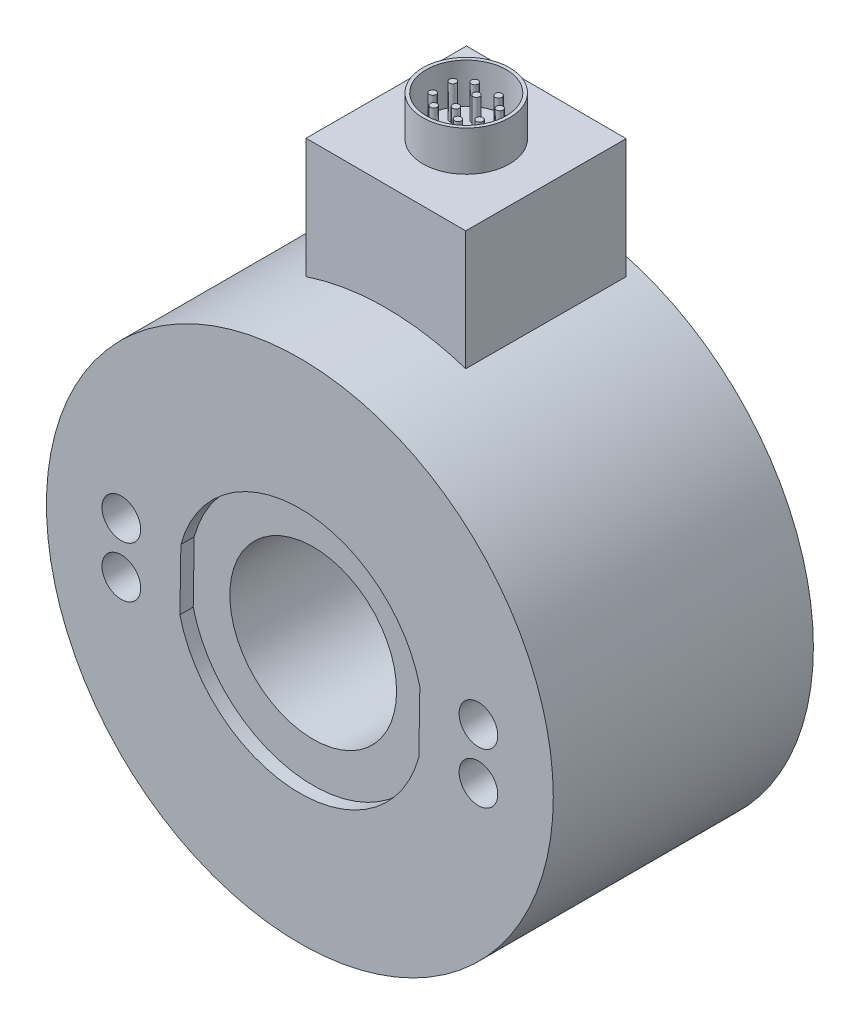
ISO-10303-21;
HEADER;
FILE_DESCRIPTION(('STEP AP214'),'2;1');
FILE_NAME('part.step','',(''),(''),'','','');
FILE_SCHEMA(('AUTOMOTIVE_DESIGN { 1 0 10303 214 1 1 1 1 }'));
ENDSEC;
DATA;
#1=APPLICATION_CONTEXT('core data for automotive mechanical design processes');
#2=APPLICATION_PROTOCOL_DEFINITION('international standard','automotive_design',2000,#1);
#3=PRODUCT_CONTEXT('',#1,'mechanical');
#4=PRODUCT('Part','Part','',(#3));
#5=PRODUCT_RELATED_PRODUCT_CATEGORY('part','',(#4));
#6=PRODUCT_DEFINITION_FORMATION('','',#4);
#7=PRODUCT_DEFINITION_CONTEXT('part definition',#1,'design');
#8=PRODUCT_DEFINITION('design','',#6,#7);
#9=PRODUCT_DEFINITION_SHAPE('','',#8);
#10=(LENGTH_UNIT() NAMED_UNIT(*) SI_UNIT(.MILLI.,.METRE.));
#11=(NAMED_UNIT(*) PLANE_ANGLE_UNIT() SI_UNIT($,.RADIAN.));
#12=(NAMED_UNIT(*) SI_UNIT($,.STERADIAN.) SOLID_ANGLE_UNIT());
#13=UNCERTAINTY_MEASURE_WITH_UNIT(LENGTH_MEASURE(1.E-05),#10,'distance_accuracy_value','');
#14=(GEOMETRIC_REPRESENTATION_CONTEXT(3) GLOBAL_UNCERTAINTY_ASSIGNED_CONTEXT((#13)) GLOBAL_UNIT_ASSIGNED_CONTEXT((#10,
#11,#12)) REPRESENTATION_CONTEXT('',''));
#15=CARTESIAN_POINT('',(0.,0.,0.));
#16=DIRECTION('',(0.,0.,1.));
#17=DIRECTION('',(1.,0.,0.));
#18=AXIS2_PLACEMENT_3D('',#15,#16,#17);
#19=CARTESIAN_POINT('',(0.,0.,39.));
#20=DIRECTION('',(0.,0.,-1.));
#21=DIRECTION('',(-1.,0.,0.));
#22=AXIS2_PLACEMENT_3D('',#19,#20,#21);
#23=CYLINDRICAL_SURFACE('',#22,38.);
#24=CARTESIAN_POINT('',(0.,0.,0.));
#25=DIRECTION('',(0.,0.,1.));
#26=DIRECTION('',(1.,0.,0.));
#27=AXIS2_PLACEMENT_3D('',#24,#25,#26);
#28=CIRCLE('',#27,38.);
#29=CARTESIAN_POINT('',(38.,0.,0.));
#30=VERTEX_POINT('',#29);
#31=EDGE_CURVE('E213',#30,#30,#28,.T.);
#32=ORIENTED_EDGE('',*,*,#31,.T.);
#33=EDGE_LOOP('',(#32));
#34=FACE_BOUND('',#33,.T.);
#35=CARTESIAN_POINT('',(0.,0.,39.));
#36=DIRECTION('',(0.,0.,1.));
#37=DIRECTION('',(1.,0.,0.));
#38=AXIS2_PLACEMENT_3D('',#35,#36,#37);
#39=CIRCLE('',#38,38.);
#40=CARTESIAN_POINT('',(38.,0.,39.));
#41=VERTEX_POINT('',#40);
#42=EDGE_CURVE('E222',#41,#41,#39,.T.);
#43=ORIENTED_EDGE('',*,*,#42,.F.);
#44=EDGE_LOOP('',(#43));
#45=FACE_BOUND('',#44,.T.);
#46=CARTESIAN_POINT('',(0.,0.,4932.63036177343));
#47=DIRECTION('',(-0.999997061406116,0.,-0.00242428940788655));
#48=DIRECTION('',(0.00242428940788655,0.,-0.999997061406116));
#49=AXIS2_PLACEMENT_3D('',#46,#47,#48);
#50=ELLIPSE('',#49,15674.6962125812,38.);
#51=CARTESIAN_POINT('',(11.895058188121,36.0902700281006,26.0283716481391));
#52=VERTEX_POINT('',#51);
#53=CARTESIAN_POINT('',(11.9532411339103,36.0710413821752,2.02844217439234));
#54=VERTEX_POINT('',#53);
#55=EDGE_CURVE('E265',#52,#54,#50,.T.);
#56=ORIENTED_EDGE('',*,*,#55,.F.);
#57=CARTESIAN_POINT('',(0.,0.,25.9995344998268));
#58=DIRECTION('',(0.00242428940788655,0.,-0.999997061406116));
#59=DIRECTION('',(-0.999997061406116,0.,-0.00242428940788655));
#60=AXIS2_PLACEMENT_3D('',#57,#58,#59);
#61=ELLIPSE('',#60,38.0001116668957,38.);
#62=CARTESIAN_POINT('',(-12.1048712856257,36.0204399078972,25.9701887023498));
#63=VERTEX_POINT('',#62);
#64=EDGE_CURVE('E236',#63,#52,#61,.T.);
#65=ORIENTED_EDGE('',*,*,#64,.F.);
#66=CARTESIAN_POINT('',(0.,0.,-4967.17777248854));
#67=DIRECTION('',(0.999997061406116,0.,0.00242428940788647));
#68=DIRECTION('',(0.00242428940788647,0.,-0.999997061406116));
#69=AXIS2_PLACEMENT_3D('',#66,#67,#68);
#70=ELLIPSE('',#69,15674.6962125817,38.);
#71=CARTESIAN_POINT('',(-12.0466883398365,36.0399403446072,1.97025922860306));
#72=VERTEX_POINT('',#71);
#73=EDGE_CURVE('E60',#72,#63,#70,.T.);
#74=ORIENTED_EDGE('',*,*,#73,.F.);
#75=CARTESIAN_POINT('',(0.,0.,1.99946397336632));
#76=DIRECTION('',(-0.00242428940788669,0.,0.999997061406116));
#77=DIRECTION('',(-0.999997061406116,0.,-0.00242428940788669));
#78=AXIS2_PLACEMENT_3D('',#75,#76,#77);
#79=ELLIPSE('',#78,38.0001116668957,38.);
#80=EDGE_CURVE('E55',#54,#72,#79,.T.);
#81=ORIENTED_EDGE('',*,*,#80,.F.);
#82=EDGE_LOOP('',(#56,#65,#74,#81));
#83=FACE_BOUND('',#82,.T.);
#84=ADVANCED_FACE('F39',(#34,#45,#83),#23,.T.);
#85=CARTESIAN_POINT('',(0.,0.,0.));
#86=DIRECTION('',(0.,0.,1.));
#87=DIRECTION('',(1.,0.,0.));
#88=AXIS2_PLACEMENT_3D('',#85,#86,#87);
#89=PLANE('',#88);
#90=CARTESIAN_POINT('',(0.,0.,0.));
#91=DIRECTION('',(0.,0.,1.));
#92=DIRECTION('',(1.,0.,0.));
#93=AXIS2_PLACEMENT_3D('',#90,#91,#92);
#94=CIRCLE('',#93,12.5);
#95=CARTESIAN_POINT('',(12.5,0.,0.));
#96=VERTEX_POINT('',#95);
#97=EDGE_CURVE('E146',#96,#96,#94,.T.);
#98=ORIENTED_EDGE('',*,*,#97,.T.);
#99=EDGE_LOOP('',(#98));
#100=FACE_BOUND('',#99,.T.);
#101=CARTESIAN_POINT('',(0.,0.,0.));
#102=DIRECTION('',(0.,0.,-1.));
#103=DIRECTION('',(-1.,0.,0.));
#104=AXIS2_PLACEMENT_3D('',#101,#102,#103);
#105=CIRCLE('',#104,13.);
#106=CARTESIAN_POINT('',(-13.,0.,0.));
#107=VERTEX_POINT('',#106);
#108=EDGE_CURVE('E209',#107,#107,#105,.T.);
#109=ORIENTED_EDGE('',*,*,#108,.T.);
#110=EDGE_LOOP('',(#109));
#111=FACE_BOUND('',#110,.T.);
#112=ADVANCED_FACE('F339',(#100,#111),#89,.F.);
#113=CARTESIAN_POINT('',(0.,0.,0.));
#114=DIRECTION('',(0.,0.,1.));
#115=DIRECTION('',(1.,0.,0.));
#116=AXIS2_PLACEMENT_3D('',#113,#114,#115);
#117=CIRCLE('',#116,17.);
#118=CARTESIAN_POINT('',(17.,0.,0.));
#119=VERTEX_POINT('',#118);
#120=EDGE_CURVE('E210',#119,#119,#117,.T.);
#121=ORIENTED_EDGE('',*,*,#120,.T.);
#122=EDGE_LOOP('',(#121));
#123=FACE_BOUND('',#122,.T.);
#124=ORIENTED_EDGE('',*,*,#31,.F.);
#125=EDGE_LOOP('',(#124));
#126=FACE_BOUND('',#125,.T.);
#127=ADVANCED_FACE('F345',(#123,#126),#89,.F.);
#128=CARTESIAN_POINT('',(0.,0.,39.));
#129=DIRECTION('',(0.,0.,1.));
#130=DIRECTION('',(1.,0.,0.));
#131=AXIS2_PLACEMENT_3D('',#128,#129,#130);
#132=PLANE('',#131);
#133=CARTESIAN_POINT('',(-26.7725934929181,3.81386705156384,39.));
#134=DIRECTION('',(0.,0.,1.));
#135=DIRECTION('',(1.,0.,0.));
#136=AXIS2_PLACEMENT_3D('',#133,#134,#135);
#137=CIRCLE('',#136,2.9);
#138=CARTESIAN_POINT('',(-23.872593492918,3.81386705156384,39.));
#139=VERTEX_POINT('',#138);
#140=EDGE_CURVE('E124',#139,#139,#137,.T.);
#141=ORIENTED_EDGE('',*,*,#140,.F.);
#142=EDGE_LOOP('',(#141));
#143=FACE_BOUND('',#142,.T.);
#144=CARTESIAN_POINT('',(-26.7725934929181,-3.81386705156384,39.));
#145=DIRECTION('',(0.,0.,1.));
#146=DIRECTION('',(1.,0.,0.));
#147=AXIS2_PLACEMENT_3D('',#144,#145,#146);
#148=CIRCLE('',#147,2.9);
#149=CARTESIAN_POINT('',(-23.872593492918,-3.81386705156384,39.));
#150=VERTEX_POINT('',#149);
#151=EDGE_CURVE('E123',#150,#150,#148,.T.);
#152=ORIENTED_EDGE('',*,*,#151,.F.);
#153=EDGE_LOOP('',(#152));
#154=FACE_BOUND('',#153,.T.);
#155=CARTESIAN_POINT('',(26.7725934929181,3.81386705156384,39.));
#156=DIRECTION('',(0.,0.,1.));
#157=DIRECTION('',(1.,0.,0.));
#158=AXIS2_PLACEMENT_3D('',#155,#156,#157);
#159=CIRCLE('',#158,2.9);
#160=CARTESIAN_POINT('',(29.6725934929181,3.81386705156384,39.));
#161=VERTEX_POINT('',#160);
#162=EDGE_CURVE('E134',#161,#161,#159,.T.);
#163=ORIENTED_EDGE('',*,*,#162,.F.);
#164=EDGE_LOOP('',(#163));
#165=FACE_BOUND('',#164,.T.);
#166=CARTESIAN_POINT('',(26.7725934929181,-3.81386705156384,39.));
#167=DIRECTION('',(0.,0.,1.));
#168=DIRECTION('',(1.,0.,0.));
#169=AXIS2_PLACEMENT_3D('',#166,#167,#168);
#170=CIRCLE('',#169,2.9);
#171=CARTESIAN_POINT('',(29.6725934929181,-3.81386705156384,39.));
#172=VERTEX_POINT('',#171);
#173=EDGE_CURVE('E140',#172,#172,#170,.T.);
#174=ORIENTED_EDGE('',*,*,#173,.F.);
#175=EDGE_LOOP('',(#174));
#176=FACE_BOUND('',#175,.T.);
#177=CARTESIAN_POINT('',(0.,0.,39.));
#178=DIRECTION('',(0.,0.,1.));
#179=DIRECTION('',(1.,0.,0.));
#180=AXIS2_PLACEMENT_3D('',#177,#178,#179);
#181=CIRCLE('',#180,18.5);
#182=CARTESIAN_POINT('',(17.9892851101113,4.31689949235877,39.));
#183=VERTEX_POINT('',#182);
#184=CARTESIAN_POINT('',(-17.8405992738003,4.8952035250516,39.));
#185=VERTEX_POINT('',#184);
#186=EDGE_CURVE('E246',#183,#185,#181,.T.);
#187=ORIENTED_EDGE('',*,*,#186,.F.);
#188=DIRECTION('',(-0.0161381687615908,-0.999869771274751,0.));
#189=VECTOR('',#188,1.);
#190=CARTESIAN_POINT('',(17.9892851101113,4.31689949235877,39.));
#191=LINE('',#190,#189);
#192=CARTESIAN_POINT('',(17.8405992738003,-4.8952035250516,39.));
#193=VERTEX_POINT('',#192);
#194=EDGE_CURVE('E221',#183,#193,#191,.T.);
#195=ORIENTED_EDGE('',*,*,#194,.T.);
#196=CARTESIAN_POINT('',(0.,0.,39.));
#197=DIRECTION('',(0.,0.,1.));
#198=DIRECTION('',(1.,0.,0.));
#199=AXIS2_PLACEMENT_3D('',#196,#197,#198);
#200=CIRCLE('',#199,18.5);
#201=CARTESIAN_POINT('',(-17.9892851101113,-4.31689949235877,39.));
#202=VERTEX_POINT('',#201);
#203=EDGE_CURVE('E240',#202,#193,#200,.T.);
#204=ORIENTED_EDGE('',*,*,#203,.F.);
#205=DIRECTION('',(0.0161381687615908,0.999869771274751,0.));
#206=VECTOR('',#205,1.);
#207=CARTESIAN_POINT('',(-17.9892851101113,-4.31689949235877,39.));
#208=LINE('',#207,#206);
#209=EDGE_CURVE('E225',#202,#185,#208,.T.);
#210=ORIENTED_EDGE('',*,*,#209,.T.);
#211=EDGE_LOOP('',(#187,#195,#204,#210));
#212=FACE_BOUND('',#211,.T.);
#213=ORIENTED_EDGE('',*,*,#42,.T.);
#214=EDGE_LOOP('',(#213));
#215=FACE_BOUND('',#214,.T.);
#216=ADVANCED_FACE('F354',(#143,#154,#165,#176,#212,#215),#132,.T.);
#217=CARTESIAN_POINT('',(0.,0.,2.));
#218=DIRECTION('',(0.,0.,-1.));
#219=DIRECTION('',(-1.,0.,0.));
#220=AXIS2_PLACEMENT_3D('',#217,#218,#219);
#221=CYLINDRICAL_SURFACE('',#220,13.);
#222=CARTESIAN_POINT('',(0.,0.,2.));
#223=DIRECTION('',(0.,0.,-1.));
#224=DIRECTION('',(-1.,0.,0.));
#225=AXIS2_PLACEMENT_3D('',#222,#223,#224);
#226=CIRCLE('',#225,13.);
#227=CARTESIAN_POINT('',(-13.,0.,2.));
#228=VERTEX_POINT('',#227);
#229=EDGE_CURVE('E218',#228,#228,#226,.T.);
#230=ORIENTED_EDGE('',*,*,#229,.T.);
#231=EDGE_LOOP('',(#230));
#232=FACE_BOUND('',#231,.T.);
#233=ORIENTED_EDGE('',*,*,#108,.F.);
#234=EDGE_LOOP('',(#233));
#235=FACE_BOUND('',#234,.T.);
#236=ADVANCED_FACE('F358',(#232,#235),#221,.T.);
#237=CARTESIAN_POINT('',(0.,0.,2.));
#238=DIRECTION('',(0.,0.,-1.));
#239=DIRECTION('',(-1.,0.,0.));
#240=AXIS2_PLACEMENT_3D('',#237,#238,#239);
#241=CYLINDRICAL_SURFACE('',#240,16.);
#242=CARTESIAN_POINT('',(0.,0.,1.));
#243=DIRECTION('',(0.,0.,1.));
#244=DIRECTION('',(1.,0.,0.));
#245=AXIS2_PLACEMENT_3D('',#242,#243,#244);
#246=CIRCLE('',#245,16.);
#247=CARTESIAN_POINT('',(16.,0.,1.));
#248=VERTEX_POINT('',#247);
#249=EDGE_CURVE('E214',#248,#248,#246,.F.);
#250=ORIENTED_EDGE('',*,*,#249,.T.);
#251=EDGE_LOOP('',(#250));
#252=FACE_BOUND('',#251,.T.);
#253=CARTESIAN_POINT('',(0.,0.,2.));
#254=DIRECTION('',(0.,0.,-1.));
#255=DIRECTION('',(-1.,0.,0.));
#256=AXIS2_PLACEMENT_3D('',#253,#254,#255);
#257=CIRCLE('',#256,16.);
#258=CARTESIAN_POINT('',(-16.,0.,2.));
#259=VERTEX_POINT('',#258);
#260=EDGE_CURVE('E217',#259,#259,#257,.T.);
#261=ORIENTED_EDGE('',*,*,#260,.F.);
#262=EDGE_LOOP('',(#261));
#263=FACE_BOUND('',#262,.T.);
#264=ADVANCED_FACE('F362',(#252,#263),#241,.F.);
#265=CARTESIAN_POINT('',(0.,0.,2.));
#266=DIRECTION('',(0.,0.,-1.));
#267=DIRECTION('',(-1.,0.,0.));
#268=AXIS2_PLACEMENT_3D('',#265,#266,#267);
#269=PLANE('',#268);
#270=ORIENTED_EDGE('',*,*,#229,.F.);
#271=EDGE_LOOP('',(#270));
#272=FACE_BOUND('',#271,.T.);
#273=ORIENTED_EDGE('',*,*,#260,.T.);
#274=EDGE_LOOP('',(#273));
#275=FACE_BOUND('',#274,.T.);
#276=ADVANCED_FACE('F366',(#272,#275),#269,.T.);
#277=CARTESIAN_POINT('',(0.,0.,1.));
#278=DIRECTION('',(0.,0.,1.));
#279=DIRECTION('',(1.,0.,0.));
#280=AXIS2_PLACEMENT_3D('',#277,#278,#279);
#281=TOROIDAL_SURFACE('',#280,17.,1.);
#282=ORIENTED_EDGE('',*,*,#120,.F.);
#283=EDGE_LOOP('',(#282));
#284=FACE_BOUND('',#283,.T.);
#285=ORIENTED_EDGE('',*,*,#249,.F.);
#286=EDGE_LOOP('',(#285));
#287=FACE_BOUND('',#286,.T.);
#288=ADVANCED_FACE('F350',(#284,#287),#281,.T.);
#289=CARTESIAN_POINT('',(0.,0.,37.));
#290=DIRECTION('',(0.,0.,1.));
#291=DIRECTION('',(1.,0.,0.));
#292=AXIS2_PLACEMENT_3D('',#289,#290,#291);
#293=PLANE('',#292);
#294=CARTESIAN_POINT('',(0.,0.,37.));
#295=DIRECTION('',(0.,0.,1.));
#296=DIRECTION('',(1.,0.,0.));
#297=AXIS2_PLACEMENT_3D('',#294,#295,#296);
#298=CIRCLE('',#297,12.5);
#299=CARTESIAN_POINT('',(12.5,0.,37.));
#300=VERTEX_POINT('',#299);
#301=EDGE_CURVE('E43',#300,#300,#298,.T.);
#302=ORIENTED_EDGE('',*,*,#301,.F.);
#303=EDGE_LOOP('',(#302));
#304=FACE_BOUND('',#303,.T.);
#305=CARTESIAN_POINT('',(0.,0.,37.));
#306=DIRECTION('',(0.,0.,1.));
#307=DIRECTION('',(1.,0.,0.));
#308=AXIS2_PLACEMENT_3D('',#305,#306,#307);
#309=CIRCLE('',#308,18.5);
#310=CARTESIAN_POINT('',(17.9892851101113,4.31689949235877,37.));
#311=VERTEX_POINT('',#310);
#312=CARTESIAN_POINT('',(-17.8405992738003,4.8952035250516,37.));
#313=VERTEX_POINT('',#312);
#314=EDGE_CURVE('E230',#311,#313,#309,.T.);
#315=ORIENTED_EDGE('',*,*,#314,.T.);
#316=DIRECTION('',(0.0161381687615908,0.999869771274751,0.));
#317=VECTOR('',#316,1.);
#318=CARTESIAN_POINT('',(-17.9892851101113,-4.31689949235877,37.));
#319=LINE('',#318,#317);
#320=CARTESIAN_POINT('',(-17.9892851101113,-4.31689949235877,37.));
#321=VERTEX_POINT('',#320);
#322=EDGE_CURVE('E237',#321,#313,#319,.T.);
#323=ORIENTED_EDGE('',*,*,#322,.F.);
#324=CARTESIAN_POINT('',(0.,0.,37.));
#325=DIRECTION('',(0.,0.,1.));
#326=DIRECTION('',(1.,0.,0.));
#327=AXIS2_PLACEMENT_3D('',#324,#325,#326);
#328=CIRCLE('',#327,18.5);
#329=CARTESIAN_POINT('',(17.8405992738003,-4.8952035250516,37.));
#330=VERTEX_POINT('',#329);
#331=EDGE_CURVE('E254',#321,#330,#328,.T.);
#332=ORIENTED_EDGE('',*,*,#331,.T.);
#333=DIRECTION('',(-0.0161381687615908,-0.999869771274751,0.));
#334=VECTOR('',#333,1.);
#335=CARTESIAN_POINT('',(17.9892851101113,4.31689949235877,37.));
#336=LINE('',#335,#334);
#337=EDGE_CURVE('E243',#311,#330,#336,.T.);
#338=ORIENTED_EDGE('',*,*,#337,.F.);
#339=EDGE_LOOP('',(#315,#323,#332,#338));
#340=FACE_BOUND('',#339,.T.);
#341=ADVANCED_FACE('F41',(#304,#340),#293,.T.);
#342=CARTESIAN_POINT('',(0.,0.,37.));
#343=DIRECTION('',(0.,0.,1.));
#344=DIRECTION('',(1.,0.,0.));
#345=AXIS2_PLACEMENT_3D('',#342,#343,#344);
#346=CYLINDRICAL_SURFACE('',#345,18.5);
#347=ORIENTED_EDGE('',*,*,#186,.T.);
#348=DIRECTION('',(0.,0.,1.));
#349=VECTOR('',#348,1.);
#350=CARTESIAN_POINT('',(-17.8405992738003,4.8952035250516,37.));
#351=LINE('',#350,#349);
#352=EDGE_CURVE('E233',#313,#185,#351,.T.);
#353=ORIENTED_EDGE('',*,*,#352,.F.);
#354=ORIENTED_EDGE('',*,*,#314,.F.);
#355=DIRECTION('',(0.,0.,1.));
#356=VECTOR('',#355,1.);
#357=CARTESIAN_POINT('',(17.9892851101113,4.31689949235877,37.));
#358=LINE('',#357,#356);
#359=EDGE_CURVE('E244',#311,#183,#358,.T.);
#360=ORIENTED_EDGE('',*,*,#359,.T.);
#361=EDGE_LOOP('',(#347,#353,#354,#360));
#362=FACE_BOUND('',#361,.T.);
#363=ADVANCED_FACE('F371',(#362),#346,.F.);
#364=CARTESIAN_POINT('',(17.9892851101113,4.31689949235877,37.));
#365=DIRECTION('',(-0.999869771274751,0.0161381687615908,0.));
#366=DIRECTION('',(-0.0161381687615909,-0.999869771274751,0.));
#367=AXIS2_PLACEMENT_3D('',#364,#365,#366);
#368=PLANE('',#367);
#369=ORIENTED_EDGE('',*,*,#194,.F.);
#370=ORIENTED_EDGE('',*,*,#359,.F.);
#371=ORIENTED_EDGE('',*,*,#337,.T.);
#372=DIRECTION('',(0.,0.,1.));
#373=VECTOR('',#372,1.);
#374=CARTESIAN_POINT('',(17.8405992738003,-4.8952035250516,37.));
#375=LINE('',#374,#373);
#376=EDGE_CURVE('E241',#330,#193,#375,.T.);
#377=ORIENTED_EDGE('',*,*,#376,.T.);
#378=EDGE_LOOP('',(#369,#370,#371,#377));
#379=FACE_BOUND('',#378,.T.);
#380=ADVANCED_FACE('F374',(#379),#368,.T.);
#381=CARTESIAN_POINT('',(0.,0.,37.));
#382=DIRECTION('',(0.,0.,1.));
#383=DIRECTION('',(1.,0.,0.));
#384=AXIS2_PLACEMENT_3D('',#381,#382,#383);
#385=CYLINDRICAL_SURFACE('',#384,18.5);
#386=ORIENTED_EDGE('',*,*,#203,.T.);
#387=ORIENTED_EDGE('',*,*,#376,.F.);
#388=ORIENTED_EDGE('',*,*,#331,.F.);
#389=DIRECTION('',(0.,0.,1.));
#390=VECTOR('',#389,1.);
#391=CARTESIAN_POINT('',(-17.9892851101113,-4.31689949235877,37.));
#392=LINE('',#391,#390);
#393=EDGE_CURVE('E238',#321,#202,#392,.T.);
#394=ORIENTED_EDGE('',*,*,#393,.T.);
#395=EDGE_LOOP('',(#386,#387,#388,#394));
#396=FACE_BOUND('',#395,.T.);
#397=ADVANCED_FACE('F380',(#396),#385,.F.);
#398=CARTESIAN_POINT('',(-17.9892851101113,-4.31689949235877,37.));
#399=DIRECTION('',(0.999869771274751,-0.0161381687615908,0.));
#400=DIRECTION('',(0.0161381687615909,0.999869771274751,0.));
#401=AXIS2_PLACEMENT_3D('',#398,#399,#400);
#402=PLANE('',#401);
#403=ORIENTED_EDGE('',*,*,#209,.F.);
#404=ORIENTED_EDGE('',*,*,#393,.F.);
#405=ORIENTED_EDGE('',*,*,#322,.T.);
#406=ORIENTED_EDGE('',*,*,#352,.T.);
#407=EDGE_LOOP('',(#403,#404,#405,#406));
#408=FACE_BOUND('',#407,.T.);
#409=ADVANCED_FACE('F376',(#408),#402,.T.);
#410=CARTESIAN_POINT('',(11.895058188121,54.,26.0283716481391));
#411=DIRECTION('',(-0.999997061406116,0.,-0.00242428940788655));
#412=DIRECTION('',(-0.00242428940788655,0.,0.999997061406116));
#413=AXIS2_PLACEMENT_3D('',#410,#411,#412);
#414=PLANE('',#413);
#415=DIRECTION('',(0.,-1.,0.));
#416=VECTOR('',#415,1.);
#417=CARTESIAN_POINT('',(11.895058188121,54.,26.0283716481391));
#418=LINE('',#417,#416);
#419=CARTESIAN_POINT('',(11.895058188121,54.,26.0283716481391));
#420=VERTEX_POINT('',#419);
#421=EDGE_CURVE('E197',#420,#52,#418,.T.);
#422=ORIENTED_EDGE('',*,*,#421,.T.);
#423=ORIENTED_EDGE('',*,*,#55,.T.);
#424=DIRECTION('',(0.,-1.,0.));
#425=VECTOR('',#424,1.);
#426=CARTESIAN_POINT('',(11.9532411339103,54.,2.02844217439234));
#427=LINE('',#426,#425);
#428=CARTESIAN_POINT('',(11.9532411339103,54.,2.02844217439234));
#429=VERTEX_POINT('',#428);
#430=EDGE_CURVE('E206',#429,#54,#427,.T.);
#431=ORIENTED_EDGE('',*,*,#430,.F.);
#432=DIRECTION('',(0.00242428940788655,0.,-0.999997061406116));
#433=VECTOR('',#432,1.);
#434=CARTESIAN_POINT('',(11.895058188121,54.,26.0283716481391));
#435=LINE('',#434,#433);
#436=EDGE_CURVE('E186',#420,#429,#435,.T.);
#437=ORIENTED_EDGE('',*,*,#436,.F.);
#438=EDGE_LOOP('',(#422,#423,#431,#437));
#439=FACE_BOUND('',#438,.T.);
#440=ADVANCED_FACE('F379',(#439),#414,.F.);
#441=CARTESIAN_POINT('',(-12.0466883398365,54.,1.97025922860306));
#442=DIRECTION('',(-0.00242428940788669,0.,0.999997061406116));
#443=DIRECTION('',(0.999997061406116,0.,0.00242428940788669));
#444=AXIS2_PLACEMENT_3D('',#441,#442,#443);
#445=PLANE('',#444);
#446=ORIENTED_EDGE('',*,*,#430,.T.);
#447=ORIENTED_EDGE('',*,*,#80,.T.);
#448=DIRECTION('',(0.,-1.,0.));
#449=VECTOR('',#448,1.);
#450=CARTESIAN_POINT('',(-12.0466883398365,54.,1.97025922860306));
#451=LINE('',#450,#449);
#452=CARTESIAN_POINT('',(-12.0466883398365,54.,1.97025922860306));
#453=VERTEX_POINT('',#452);
#454=EDGE_CURVE('E203',#453,#72,#451,.T.);
#455=ORIENTED_EDGE('',*,*,#454,.F.);
#456=DIRECTION('',(-0.999997061406116,0.,-0.00242428940788669));
#457=VECTOR('',#456,1.);
#458=CARTESIAN_POINT('',(-12.0466883398365,54.,1.97025922860306));
#459=LINE('',#458,#457);
#460=EDGE_CURVE('E191',#429,#453,#459,.T.);
#461=ORIENTED_EDGE('',*,*,#460,.F.);
#462=EDGE_LOOP('',(#446,#447,#455,#461));
#463=FACE_BOUND('',#462,.T.);
#464=ADVANCED_FACE('F522',(#463),#445,.F.);
#465=CARTESIAN_POINT('',(-12.1048712856257,54.,25.9701887023498));
#466=DIRECTION('',(0.999997061406116,0.,0.00242428940788647));
#467=DIRECTION('',(0.00242428940788647,0.,-0.999997061406116));
#468=AXIS2_PLACEMENT_3D('',#465,#466,#467);
#469=PLANE('',#468);
#470=ORIENTED_EDGE('',*,*,#454,.T.);
#471=ORIENTED_EDGE('',*,*,#73,.T.);
#472=DIRECTION('',(0.,-1.,0.));
#473=VECTOR('',#472,1.);
#474=CARTESIAN_POINT('',(-12.1048712856257,54.,25.9701887023498));
#475=LINE('',#474,#473);
#476=CARTESIAN_POINT('',(-12.1048712856257,54.,25.9701887023498));
#477=VERTEX_POINT('',#476);
#478=EDGE_CURVE('E200',#477,#63,#475,.T.);
#479=ORIENTED_EDGE('',*,*,#478,.F.);
#480=DIRECTION('',(-0.00242428940788647,0.,0.999997061406116));
#481=VECTOR('',#480,1.);
#482=CARTESIAN_POINT('',(-12.1048712856257,54.,25.9701887023498));
#483=LINE('',#482,#481);
#484=EDGE_CURVE('E193',#453,#477,#483,.T.);
#485=ORIENTED_EDGE('',*,*,#484,.F.);
#486=EDGE_LOOP('',(#470,#471,#479,#485));
#487=FACE_BOUND('',#486,.T.);
#488=ADVANCED_FACE('F526',(#487),#469,.F.);
#489=CARTESIAN_POINT('',(-12.1048712856257,54.,25.9701887023498));
#490=DIRECTION('',(0.00242428940788655,0.,-0.999997061406116));
#491=DIRECTION('',(-0.999997061406116,0.,-0.00242428940788655));
#492=AXIS2_PLACEMENT_3D('',#489,#490,#491);
#493=PLANE('',#492);
#494=ORIENTED_EDGE('',*,*,#478,.T.);
#495=ORIENTED_EDGE('',*,*,#64,.T.);
#496=ORIENTED_EDGE('',*,*,#421,.F.);
#497=DIRECTION('',(0.999997061406116,0.,0.00242428940788655));
#498=VECTOR('',#497,1.);
#499=CARTESIAN_POINT('',(-12.1048712856257,54.,25.9701887023498));
#500=LINE('',#499,#498);
#501=EDGE_CURVE('E195',#477,#420,#500,.T.);
#502=ORIENTED_EDGE('',*,*,#501,.F.);
#503=EDGE_LOOP('',(#494,#495,#496,#502));
#504=FACE_BOUND('',#503,.T.);
#505=ADVANCED_FACE('F336',(#504),#493,.F.);
#506=CARTESIAN_POINT('',(0.,54.,0.));
#507=DIRECTION('',(0.,-1.,0.));
#508=DIRECTION('',(0.,0.,-1.));
#509=AXIS2_PLACEMENT_3D('',#506,#507,#508);
#510=PLANE('',#509);
#511=CARTESIAN_POINT('',(0.,54.,14.0522101714282));
#512=DIRECTION('',(0.,-1.,0.));
#513=DIRECTION('',(0.,0.,-1.));
#514=AXIS2_PLACEMENT_3D('',#511,#512,#513);
#515=CIRCLE('',#514,6.5);
#516=CARTESIAN_POINT('',(0.,54.,7.55221017142821));
#517=VERTEX_POINT('',#516);
#518=EDGE_CURVE('E267',#517,#517,#515,.F.);
#519=ORIENTED_EDGE('',*,*,#518,.F.);
#520=EDGE_LOOP('',(#519));
#521=FACE_BOUND('',#520,.T.);
#522=ORIENTED_EDGE('',*,*,#436,.T.);
#523=ORIENTED_EDGE('',*,*,#460,.T.);
#524=ORIENTED_EDGE('',*,*,#484,.T.);
#525=ORIENTED_EDGE('',*,*,#501,.T.);
#526=EDGE_LOOP('',(#522,#523,#524,#525));
#527=FACE_BOUND('',#526,.T.);
#528=ADVANCED_FACE('F306',(#521,#527),#510,.F.);
#529=CARTESIAN_POINT('',(0.,60.,14.0522101714282));
#530=DIRECTION('',(0.,-1.,0.));
#531=DIRECTION('',(0.,0.,-1.));
#532=AXIS2_PLACEMENT_3D('',#529,#530,#531);
#533=CYLINDRICAL_SURFACE('',#532,6.);
#534=CARTESIAN_POINT('',(0.,60.,14.0522101714282));
#535=DIRECTION('',(0.,1.,0.));
#536=DIRECTION('',(0.,0.,1.));
#537=AXIS2_PLACEMENT_3D('',#534,#535,#536);
#538=CIRCLE('',#537,6.);
#539=CARTESIAN_POINT('',(0.,60.,20.0522101714282));
#540=VERTEX_POINT('',#539);
#541=EDGE_CURVE('E180',#540,#540,#538,.T.);
#542=ORIENTED_EDGE('',*,*,#541,.T.);
#543=EDGE_LOOP('',(#542));
#544=FACE_BOUND('',#543,.T.);
#545=CARTESIAN_POINT('',(0.,54.,14.0522101714282));
#546=DIRECTION('',(0.,1.,0.));
#547=DIRECTION('',(0.,0.,1.));
#548=AXIS2_PLACEMENT_3D('',#545,#546,#547);
#549=CIRCLE('',#548,6.);
#550=CARTESIAN_POINT('',(0.,54.,20.0522101714282));
#551=VERTEX_POINT('',#550);
#552=EDGE_CURVE('E179',#551,#551,#549,.T.);
#553=ORIENTED_EDGE('',*,*,#552,.F.);
#554=EDGE_LOOP('',(#553));
#555=FACE_BOUND('',#554,.T.);
#556=ADVANCED_FACE('F325',(#544,#555),#533,.F.);
#557=CARTESIAN_POINT('',(0.,60.,14.0522101714282));
#558=DIRECTION('',(0.,-1.,0.));
#559=DIRECTION('',(0.,0.,-1.));
#560=AXIS2_PLACEMENT_3D('',#557,#558,#559);
#561=CYLINDRICAL_SURFACE('',#560,6.5);
#562=CARTESIAN_POINT('',(0.,60.,14.0522101714282));
#563=DIRECTION('',(0.,1.,0.));
#564=DIRECTION('',(0.,0.,1.));
#565=AXIS2_PLACEMENT_3D('',#562,#563,#564);
#566=CIRCLE('',#565,6.5);
#567=CARTESIAN_POINT('',(0.,60.,20.5522101714282));
#568=VERTEX_POINT('',#567);
#569=EDGE_CURVE('E183',#568,#568,#566,.T.);
#570=ORIENTED_EDGE('',*,*,#569,.F.);
#571=EDGE_LOOP('',(#570));
#572=FACE_BOUND('',#571,.T.);
#573=ORIENTED_EDGE('',*,*,#518,.T.);
#574=EDGE_LOOP('',(#573));
#575=FACE_BOUND('',#574,.T.);
#576=ADVANCED_FACE('F327',(#572,#575),#561,.T.);
#577=CARTESIAN_POINT('',(0.,60.,0.));
#578=DIRECTION('',(0.,1.,0.));
#579=DIRECTION('',(0.,0.,1.));
#580=AXIS2_PLACEMENT_3D('',#577,#578,#579);
#581=PLANE('',#580);
#582=ORIENTED_EDGE('',*,*,#541,.F.);
#583=EDGE_LOOP('',(#582));
#584=FACE_BOUND('',#583,.T.);
#585=ORIENTED_EDGE('',*,*,#569,.T.);
#586=EDGE_LOOP('',(#585));
#587=FACE_BOUND('',#586,.T.);
#588=ADVANCED_FACE('F303',(#584,#587),#581,.T.);
#589=CARTESIAN_POINT('',(-1.80404632685006,54.,17.1255369918936));
#590=DIRECTION('',(0.,-1.,0.));
#591=DIRECTION('',(0.,0.,-1.));
#592=AXIS2_PLACEMENT_3D('',#589,#590,#591);
#593=CIRCLE('',#592,0.5);
#594=CARTESIAN_POINT('',(-1.80404632685006,54.,16.6255369918936));
#595=VERTEX_POINT('',#594);
#596=EDGE_CURVE('E11',#595,#595,#593,.F.);
#597=ORIENTED_EDGE('',*,*,#596,.F.);
#598=EDGE_LOOP('',(#597));
#599=FACE_BOUND('',#598,.T.);
#600=CARTESIAN_POINT('',(1.78257665811638,54.,17.0823246667735));
#601=DIRECTION('',(0.,-1.,0.));
#602=DIRECTION('',(0.,0.,-1.));
#603=AXIS2_PLACEMENT_3D('',#600,#601,#602);
#604=CIRCLE('',#603,0.5);
#605=CARTESIAN_POINT('',(1.78257665811638,54.,16.5823246667735));
#606=VERTEX_POINT('',#605);
#607=EDGE_CURVE('E48',#606,#606,#604,.F.);
#608=ORIENTED_EDGE('',*,*,#607,.F.);
#609=EDGE_LOOP('',(#608));
#610=FACE_BOUND('',#609,.T.);
#611=CARTESIAN_POINT('',(1.76817254974302,54.,10.9749827164692));
#612=DIRECTION('',(0.,-1.,0.));
#613=DIRECTION('',(0.,0.,-1.));
#614=AXIS2_PLACEMENT_3D('',#611,#612,#613);
#615=CIRCLE('',#614,0.5);
#616=CARTESIAN_POINT('',(1.76817254974302,54.,10.4749827164692));
#617=VERTEX_POINT('',#616);
#618=EDGE_CURVE('E291',#617,#617,#615,.F.);
#619=ORIENTED_EDGE('',*,*,#618,.F.);
#620=EDGE_LOOP('',(#619));
#621=FACE_BOUND('',#620,.T.);
#622=CARTESIAN_POINT('',(-1.74642989335662,54.,11.0325991499626));
#623=DIRECTION('',(0.,-1.,0.));
#624=DIRECTION('',(0.,0.,-1.));
#625=AXIS2_PLACEMENT_3D('',#622,#623,#624);
#626=CIRCLE('',#625,0.5);
#627=CARTESIAN_POINT('',(-1.74642989335662,54.,10.5325991499626));
#628=VERTEX_POINT('',#627);
#629=EDGE_CURVE('E288',#628,#628,#626,.F.);
#630=ORIENTED_EDGE('',*,*,#629,.F.);
#631=EDGE_LOOP('',(#630));
#632=FACE_BOUND('',#631,.T.);
#633=CARTESIAN_POINT('',(-3.52933602108881,54.,15.5515267233211));
#634=DIRECTION('',(0.,-1.,0.));
#635=DIRECTION('',(0.,0.,-1.));
#636=AXIS2_PLACEMENT_3D('',#633,#634,#635);
#637=CIRCLE('',#636,0.5);
#638=CARTESIAN_POINT('',(-3.52933602108881,54.,15.0515267233211));
#639=VERTEX_POINT('',#638);
#640=EDGE_CURVE('E285',#639,#639,#637,.F.);
#641=ORIENTED_EDGE('',*,*,#640,.F.);
#642=EDGE_LOOP('',(#641));
#643=FACE_BOUND('',#642,.T.);
#644=CARTESIAN_POINT('',(-0.0164806614512437,54.,15.5881189666506));
#645=DIRECTION('',(0.,-1.,0.));
#646=DIRECTION('',(0.,0.,-1.));
#647=AXIS2_PLACEMENT_3D('',#644,#645,#646);
#648=CIRCLE('',#647,0.5);
#649=CARTESIAN_POINT('',(-0.0164806614512437,54.,15.0881189666506));
#650=VERTEX_POINT('',#649);
#651=EDGE_CURVE('E282',#650,#650,#648,.F.);
#652=ORIENTED_EDGE('',*,*,#651,.F.);
#653=EDGE_LOOP('',(#652));
#654=FACE_BOUND('',#653,.T.);
#655=CARTESIAN_POINT('',(3.47197986929995,54.,15.5271318944347));
#656=DIRECTION('',(0.,-1.,0.));
#657=DIRECTION('',(0.,0.,-1.));
#658=AXIS2_PLACEMENT_3D('',#655,#656,#657);
#659=CIRCLE('',#658,0.5);
#660=CARTESIAN_POINT('',(3.47197986929995,54.,15.0271318944347));
#661=VERTEX_POINT('',#660);
#662=EDGE_CURVE('E279',#661,#661,#659,.F.);
#663=ORIENTED_EDGE('',*,*,#662,.F.);
#664=EDGE_LOOP('',(#663));
#665=FACE_BOUND('',#664,.T.);
#666=CARTESIAN_POINT('',(3.50857211262951,54.,12.5387653558541));
#667=DIRECTION('',(0.,-1.,0.));
#668=DIRECTION('',(0.,0.,-1.));
#669=AXIS2_PLACEMENT_3D('',#666,#667,#668);
#670=CIRCLE('',#669,0.5);
#671=CARTESIAN_POINT('',(3.50857211262951,54.,12.0387653558541));
#672=VERTEX_POINT('',#671);
#673=EDGE_CURVE('E276',#672,#672,#670,.F.);
#674=ORIENTED_EDGE('',*,*,#673,.F.);
#675=EDGE_LOOP('',(#674));
#676=FACE_BOUND('',#675,.T.);
#677=CARTESIAN_POINT('',(0.0201115818783126,54.,12.5387653558541));
#678=DIRECTION('',(0.,-1.,0.));
#679=DIRECTION('',(0.,0.,-1.));
#680=AXIS2_PLACEMENT_3D('',#677,#678,#679);
#681=CIRCLE('',#680,0.5);
#682=CARTESIAN_POINT('',(0.0201115818783126,54.,12.0387653558541));
#683=VERTEX_POINT('',#682);
#684=EDGE_CURVE('E273',#683,#683,#681,.F.);
#685=ORIENTED_EDGE('',*,*,#684,.F.);
#686=EDGE_LOOP('',(#685));
#687=FACE_BOUND('',#686,.T.);
#688=CARTESIAN_POINT('',(-3.51224579437939,54.,12.5530062003093));
#689=DIRECTION('',(0.,-1.,0.));
#690=DIRECTION('',(0.,0.,-1.));
#691=AXIS2_PLACEMENT_3D('',#688,#689,#690);
#692=CIRCLE('',#691,0.5);
#693=CARTESIAN_POINT('',(-3.51224579437939,54.,12.0530062003093));
#694=VERTEX_POINT('',#693);
#695=EDGE_CURVE('E270',#694,#694,#692,.F.);
#696=ORIENTED_EDGE('',*,*,#695,.F.);
#697=EDGE_LOOP('',(#696));
#698=FACE_BOUND('',#697,.T.);
#699=ORIENTED_EDGE('',*,*,#552,.T.);
#700=EDGE_LOOP('',(#699));
#701=FACE_BOUND('',#700,.T.);
#702=ADVANCED_FACE('F299',(#599,#610,#621,#632,#643,#654,#665,#676,#687,#698,#701),#510,.F.);
#703=CARTESIAN_POINT('',(-3.51224579437939,59.,12.5530062003093));
#704=DIRECTION('',(0.,-1.,0.));
#705=DIRECTION('',(0.,0.,-1.));
#706=AXIS2_PLACEMENT_3D('',#703,#704,#705);
#707=CYLINDRICAL_SURFACE('',#706,0.5);
#708=CARTESIAN_POINT('',(-3.51224579437939,59.,12.5530062003093));
#709=DIRECTION('',(0.,1.,0.));
#710=DIRECTION('',(0.,0.,1.));
#711=AXIS2_PLACEMENT_3D('',#708,#709,#710);
#712=CIRCLE('',#711,0.5);
#713=CARTESIAN_POINT('',(-3.51224579437939,59.,13.0530062003093));
#714=VERTEX_POINT('',#713);
#715=EDGE_CURVE('E176',#714,#714,#712,.T.);
#716=ORIENTED_EDGE('',*,*,#715,.F.);
#717=EDGE_LOOP('',(#716));
#718=FACE_BOUND('',#717,.T.);
#719=ORIENTED_EDGE('',*,*,#695,.T.);
#720=EDGE_LOOP('',(#719));
#721=FACE_BOUND('',#720,.T.);
#722=ADVANCED_FACE('F302',(#718,#721),#707,.T.);
#723=CARTESIAN_POINT('',(-3.51224579437939,59.,12.5530062003093));
#724=DIRECTION('',(0.,1.,0.));
#725=DIRECTION('',(0.,0.,1.));
#726=AXIS2_PLACEMENT_3D('',#723,#724,#725);
#727=PLANE('',#726);
#728=ORIENTED_EDGE('',*,*,#715,.T.);
#729=EDGE_LOOP('',(#728));
#730=FACE_BOUND('',#729,.T.);
#731=ADVANCED_FACE('F497',(#730),#727,.T.);
#732=CARTESIAN_POINT('',(0.0201115818783126,59.,12.5387653558541));
#733=DIRECTION('',(0.,-1.,0.));
#734=DIRECTION('',(0.,0.,-1.));
#735=AXIS2_PLACEMENT_3D('',#732,#733,#734);
#736=CYLINDRICAL_SURFACE('',#735,0.5);
#737=CARTESIAN_POINT('',(0.0201115818783126,59.,12.5387653558541));
#738=DIRECTION('',(0.,1.,0.));
#739=DIRECTION('',(0.,0.,1.));
#740=AXIS2_PLACEMENT_3D('',#737,#738,#739);
#741=CIRCLE('',#740,0.5);
#742=CARTESIAN_POINT('',(0.0201115818783126,59.,13.0387653558541));
#743=VERTEX_POINT('',#742);
#744=EDGE_CURVE('E173',#743,#743,#741,.T.);
#745=ORIENTED_EDGE('',*,*,#744,.F.);
#746=EDGE_LOOP('',(#745));
#747=FACE_BOUND('',#746,.T.);
#748=ORIENTED_EDGE('',*,*,#684,.T.);
#749=EDGE_LOOP('',(#748));
#750=FACE_BOUND('',#749,.T.);
#751=ADVANCED_FACE('F493',(#747,#750),#736,.T.);
#752=CARTESIAN_POINT('',(0.0201115818783126,59.,12.5387653558541));
#753=DIRECTION('',(0.,1.,0.));
#754=DIRECTION('',(0.,0.,1.));
#755=AXIS2_PLACEMENT_3D('',#752,#753,#754);
#756=PLANE('',#755);
#757=ORIENTED_EDGE('',*,*,#744,.T.);
#758=EDGE_LOOP('',(#757));
#759=FACE_BOUND('',#758,.T.);
#760=ADVANCED_FACE('F489',(#759),#756,.T.);
#761=CARTESIAN_POINT('',(3.50857211262951,59.,12.5387653558541));
#762=DIRECTION('',(0.,-1.,0.));
#763=DIRECTION('',(0.,0.,-1.));
#764=AXIS2_PLACEMENT_3D('',#761,#762,#763);
#765=CYLINDRICAL_SURFACE('',#764,0.5);
#766=CARTESIAN_POINT('',(3.50857211262951,59.,12.5387653558541));
#767=DIRECTION('',(0.,1.,0.));
#768=DIRECTION('',(0.,0.,1.));
#769=AXIS2_PLACEMENT_3D('',#766,#767,#768);
#770=CIRCLE('',#769,0.5);
#771=CARTESIAN_POINT('',(3.50857211262951,59.,13.0387653558541));
#772=VERTEX_POINT('',#771);
#773=EDGE_CURVE('E170',#772,#772,#770,.T.);
#774=ORIENTED_EDGE('',*,*,#773,.F.);
#775=EDGE_LOOP('',(#774));
#776=FACE_BOUND('',#775,.T.);
#777=ORIENTED_EDGE('',*,*,#673,.T.);
#778=EDGE_LOOP('',(#777));
#779=FACE_BOUND('',#778,.T.);
#780=ADVANCED_FACE('F485',(#776,#779),#765,.T.);
#781=CARTESIAN_POINT('',(3.50857211262951,59.,12.5387653558541));
#782=DIRECTION('',(0.,1.,0.));
#783=DIRECTION('',(0.,0.,1.));
#784=AXIS2_PLACEMENT_3D('',#781,#782,#783);
#785=PLANE('',#784);
#786=ORIENTED_EDGE('',*,*,#773,.T.);
#787=EDGE_LOOP('',(#786));
#788=FACE_BOUND('',#787,.T.);
#789=ADVANCED_FACE('F481',(#788),#785,.T.);
#790=CARTESIAN_POINT('',(3.47197986929995,59.,15.5271318944347));
#791=DIRECTION('',(0.,-1.,0.));
#792=DIRECTION('',(0.,0.,-1.));
#793=AXIS2_PLACEMENT_3D('',#790,#791,#792);
#794=CYLINDRICAL_SURFACE('',#793,0.5);
#795=CARTESIAN_POINT('',(3.47197986929995,59.,15.5271318944347));
#796=DIRECTION('',(0.,1.,0.));
#797=DIRECTION('',(0.,0.,1.));
#798=AXIS2_PLACEMENT_3D('',#795,#796,#797);
#799=CIRCLE('',#798,0.5);
#800=CARTESIAN_POINT('',(3.47197986929995,59.,16.0271318944347));
#801=VERTEX_POINT('',#800);
#802=EDGE_CURVE('E167',#801,#801,#799,.T.);
#803=ORIENTED_EDGE('',*,*,#802,.F.);
#804=EDGE_LOOP('',(#803));
#805=FACE_BOUND('',#804,.T.);
#806=ORIENTED_EDGE('',*,*,#662,.T.);
#807=EDGE_LOOP('',(#806));
#808=FACE_BOUND('',#807,.T.);
#809=ADVANCED_FACE('F477',(#805,#808),#794,.T.);
#810=CARTESIAN_POINT('',(3.47197986929995,59.,15.5271318944347));
#811=DIRECTION('',(0.,1.,0.));
#812=DIRECTION('',(0.,0.,1.));
#813=AXIS2_PLACEMENT_3D('',#810,#811,#812);
#814=PLANE('',#813);
#815=ORIENTED_EDGE('',*,*,#802,.T.);
#816=EDGE_LOOP('',(#815));
#817=FACE_BOUND('',#816,.T.);
#818=ADVANCED_FACE('F473',(#817),#814,.T.);
#819=CARTESIAN_POINT('',(-0.0164806614512437,59.,15.5881189666506));
#820=DIRECTION('',(0.,-1.,0.));
#821=DIRECTION('',(0.,0.,-1.));
#822=AXIS2_PLACEMENT_3D('',#819,#820,#821);
#823=CYLINDRICAL_SURFACE('',#822,0.5);
#824=CARTESIAN_POINT('',(-0.0164806614512437,59.,15.5881189666506));
#825=DIRECTION('',(0.,1.,0.));
#826=DIRECTION('',(0.,0.,1.));
#827=AXIS2_PLACEMENT_3D('',#824,#825,#826);
#828=CIRCLE('',#827,0.5);
#829=CARTESIAN_POINT('',(-0.0164806614512437,59.,16.0881189666506));
#830=VERTEX_POINT('',#829);
#831=EDGE_CURVE('E164',#830,#830,#828,.T.);
#832=ORIENTED_EDGE('',*,*,#831,.F.);
#833=EDGE_LOOP('',(#832));
#834=FACE_BOUND('',#833,.T.);
#835=ORIENTED_EDGE('',*,*,#651,.T.);
#836=EDGE_LOOP('',(#835));
#837=FACE_BOUND('',#836,.T.);
#838=ADVANCED_FACE('F469',(#834,#837),#823,.T.);
#839=CARTESIAN_POINT('',(-0.0164806614512437,59.,15.5881189666506));
#840=DIRECTION('',(0.,1.,0.));
#841=DIRECTION('',(0.,0.,1.));
#842=AXIS2_PLACEMENT_3D('',#839,#840,#841);
#843=PLANE('',#842);
#844=ORIENTED_EDGE('',*,*,#831,.T.);
#845=EDGE_LOOP('',(#844));
#846=FACE_BOUND('',#845,.T.);
#847=ADVANCED_FACE('F465',(#846),#843,.T.);
#848=CARTESIAN_POINT('',(-3.52933602108881,59.,15.5515267233211));
#849=DIRECTION('',(0.,-1.,0.));
#850=DIRECTION('',(0.,0.,-1.));
#851=AXIS2_PLACEMENT_3D('',#848,#849,#850);
#852=CYLINDRICAL_SURFACE('',#851,0.5);
#853=CARTESIAN_POINT('',(-3.52933602108881,59.,15.5515267233211));
#854=DIRECTION('',(0.,1.,0.));
#855=DIRECTION('',(0.,0.,1.));
#856=AXIS2_PLACEMENT_3D('',#853,#854,#855);
#857=CIRCLE('',#856,0.5);
#858=CARTESIAN_POINT('',(-3.52933602108881,59.,16.0515267233211));
#859=VERTEX_POINT('',#858);
#860=EDGE_CURVE('E161',#859,#859,#857,.T.);
#861=ORIENTED_EDGE('',*,*,#860,.F.);
#862=EDGE_LOOP('',(#861));
#863=FACE_BOUND('',#862,.T.);
#864=ORIENTED_EDGE('',*,*,#640,.T.);
#865=EDGE_LOOP('',(#864));
#866=FACE_BOUND('',#865,.T.);
#867=ADVANCED_FACE('F461',(#863,#866),#852,.T.);
#868=CARTESIAN_POINT('',(-3.52933602108881,59.,15.5515267233211));
#869=DIRECTION('',(0.,1.,0.));
#870=DIRECTION('',(0.,0.,1.));
#871=AXIS2_PLACEMENT_3D('',#868,#869,#870);
#872=PLANE('',#871);
#873=ORIENTED_EDGE('',*,*,#860,.T.);
#874=EDGE_LOOP('',(#873));
#875=FACE_BOUND('',#874,.T.);
#876=ADVANCED_FACE('F457',(#875),#872,.T.);
#877=CARTESIAN_POINT('',(-1.74642989335662,59.,11.0325991499626));
#878=DIRECTION('',(0.,-1.,0.));
#879=DIRECTION('',(0.,0.,-1.));
#880=AXIS2_PLACEMENT_3D('',#877,#878,#879);
#881=CYLINDRICAL_SURFACE('',#880,0.5);
#882=CARTESIAN_POINT('',(-1.74642989335662,59.,11.0325991499626));
#883=DIRECTION('',(0.,1.,0.));
#884=DIRECTION('',(0.,0.,1.));
#885=AXIS2_PLACEMENT_3D('',#882,#883,#884);
#886=CIRCLE('',#885,0.5);
#887=CARTESIAN_POINT('',(-1.74642989335662,59.,11.5325991499626));
#888=VERTEX_POINT('',#887);
#889=EDGE_CURVE('E158',#888,#888,#886,.T.);
#890=ORIENTED_EDGE('',*,*,#889,.F.);
#891=EDGE_LOOP('',(#890));
#892=FACE_BOUND('',#891,.T.);
#893=ORIENTED_EDGE('',*,*,#629,.T.);
#894=EDGE_LOOP('',(#893));
#895=FACE_BOUND('',#894,.T.);
#896=ADVANCED_FACE('F453',(#892,#895),#881,.T.);
#897=CARTESIAN_POINT('',(-1.74642989335662,59.,11.0325991499626));
#898=DIRECTION('',(0.,1.,0.));
#899=DIRECTION('',(0.,0.,1.));
#900=AXIS2_PLACEMENT_3D('',#897,#898,#899);
#901=PLANE('',#900);
#902=ORIENTED_EDGE('',*,*,#889,.T.);
#903=EDGE_LOOP('',(#902));
#904=FACE_BOUND('',#903,.T.);
#905=ADVANCED_FACE('F449',(#904),#901,.T.);
#906=CARTESIAN_POINT('',(1.76817254974302,59.,10.9749827164692));
#907=DIRECTION('',(0.,-1.,0.));
#908=DIRECTION('',(0.,0.,-1.));
#909=AXIS2_PLACEMENT_3D('',#906,#907,#908);
#910=CYLINDRICAL_SURFACE('',#909,0.5);
#911=CARTESIAN_POINT('',(1.76817254974302,59.,10.9749827164692));
#912=DIRECTION('',(0.,1.,0.));
#913=DIRECTION('',(0.,0.,1.));
#914=AXIS2_PLACEMENT_3D('',#911,#912,#913);
#915=CIRCLE('',#914,0.5);
#916=CARTESIAN_POINT('',(1.76817254974302,59.,11.4749827164692));
#917=VERTEX_POINT('',#916);
#918=EDGE_CURVE('E155',#917,#917,#915,.T.);
#919=ORIENTED_EDGE('',*,*,#918,.F.);
#920=EDGE_LOOP('',(#919));
#921=FACE_BOUND('',#920,.T.);
#922=ORIENTED_EDGE('',*,*,#618,.T.);
#923=EDGE_LOOP('',(#922));
#924=FACE_BOUND('',#923,.T.);
#925=ADVANCED_FACE('F445',(#921,#924),#910,.T.);
#926=CARTESIAN_POINT('',(1.76817254974302,59.,10.9749827164692));
#927=DIRECTION('',(0.,1.,0.));
#928=DIRECTION('',(0.,0.,1.));
#929=AXIS2_PLACEMENT_3D('',#926,#927,#928);
#930=PLANE('',#929);
#931=ORIENTED_EDGE('',*,*,#918,.T.);
#932=EDGE_LOOP('',(#931));
#933=FACE_BOUND('',#932,.T.);
#934=ADVANCED_FACE('F441',(#933),#930,.T.);
#935=CARTESIAN_POINT('',(1.78257665811638,59.,17.0823246667735));
#936=DIRECTION('',(0.,-1.,0.));
#937=DIRECTION('',(0.,0.,-1.));
#938=AXIS2_PLACEMENT_3D('',#935,#936,#937);
#939=CYLINDRICAL_SURFACE('',#938,0.5);
#940=CARTESIAN_POINT('',(1.78257665811638,59.,17.0823246667735));
#941=DIRECTION('',(0.,1.,0.));
#942=DIRECTION('',(0.,0.,1.));
#943=AXIS2_PLACEMENT_3D('',#940,#941,#942);
#944=CIRCLE('',#943,0.5);
#945=CARTESIAN_POINT('',(1.78257665811638,59.,17.5823246667735));
#946=VERTEX_POINT('',#945);
#947=EDGE_CURVE('E152',#946,#946,#944,.T.);
#948=ORIENTED_EDGE('',*,*,#947,.F.);
#949=EDGE_LOOP('',(#948));
#950=FACE_BOUND('',#949,.T.);
#951=ORIENTED_EDGE('',*,*,#607,.T.);
#952=EDGE_LOOP('',(#951));
#953=FACE_BOUND('',#952,.T.);
#954=ADVANCED_FACE('F297',(#950,#953),#939,.T.);
#955=CARTESIAN_POINT('',(1.78257665811638,59.,17.0823246667735));
#956=DIRECTION('',(0.,1.,0.));
#957=DIRECTION('',(0.,0.,1.));
#958=AXIS2_PLACEMENT_3D('',#955,#956,#957);
#959=PLANE('',#958);
#960=ORIENTED_EDGE('',*,*,#947,.T.);
#961=EDGE_LOOP('',(#960));
#962=FACE_BOUND('',#961,.T.);
#963=ADVANCED_FACE('F434',(#962),#959,.T.);
#964=CARTESIAN_POINT('',(-1.80404632685006,59.,17.1255369918936));
#965=DIRECTION('',(0.,-1.,0.));
#966=DIRECTION('',(0.,0.,-1.));
#967=AXIS2_PLACEMENT_3D('',#964,#965,#966);
#968=CYLINDRICAL_SURFACE('',#967,0.5);
#969=CARTESIAN_POINT('',(-1.80404632685006,59.,17.1255369918936));
#970=DIRECTION('',(0.,1.,0.));
#971=DIRECTION('',(0.,0.,1.));
#972=AXIS2_PLACEMENT_3D('',#969,#970,#971);
#973=CIRCLE('',#972,0.5);
#974=CARTESIAN_POINT('',(-1.80404632685006,59.,17.6255369918936));
#975=VERTEX_POINT('',#974);
#976=EDGE_CURVE('E149',#975,#975,#973,.T.);
#977=ORIENTED_EDGE('',*,*,#976,.F.);
#978=EDGE_LOOP('',(#977));
#979=FACE_BOUND('',#978,.T.);
#980=ORIENTED_EDGE('',*,*,#596,.T.);
#981=EDGE_LOOP('',(#980));
#982=FACE_BOUND('',#981,.T.);
#983=ADVANCED_FACE('F427',(#979,#982),#968,.T.);
#984=CARTESIAN_POINT('',(-1.80404632685006,59.,17.1255369918936));
#985=DIRECTION('',(0.,1.,0.));
#986=DIRECTION('',(0.,0.,1.));
#987=AXIS2_PLACEMENT_3D('',#984,#985,#986);
#988=PLANE('',#987);
#989=ORIENTED_EDGE('',*,*,#976,.T.);
#990=EDGE_LOOP('',(#989));
#991=FACE_BOUND('',#990,.T.);
#992=ADVANCED_FACE('F414',(#991),#988,.T.);
#993=CARTESIAN_POINT('',(0.,0.,46.));
#994=DIRECTION('',(0.,0.,-1.));
#995=DIRECTION('',(-1.,0.,0.));
#996=AXIS2_PLACEMENT_3D('',#993,#994,#995);
#997=CYLINDRICAL_SURFACE('',#996,12.5);
#998=ORIENTED_EDGE('',*,*,#301,.T.);
#999=EDGE_LOOP('',(#998));
#1000=FACE_BOUND('',#999,.T.);
#1001=ORIENTED_EDGE('',*,*,#97,.F.);
#1002=EDGE_LOOP('',(#1001));
#1003=FACE_BOUND('',#1002,.T.);
#1004=ADVANCED_FACE('F410',(#1000,#1003),#997,.F.);
#1005=CARTESIAN_POINT('',(26.7725934929181,-3.81386705156384,25.));
#1006=DIRECTION('',(0.,0.,1.));
#1007=DIRECTION('',(1.,0.,0.));
#1008=AXIS2_PLACEMENT_3D('',#1005,#1006,#1007);
#1009=CONICAL_SURFACE('',#1008,2.9,1.02974425867665);
#1010=CARTESIAN_POINT('',(26.772593492918,-3.81386705156384,23.2575042048201));
#1011=VERTEX_POINT('',#1010);
#1012=VERTEX_LOOP('',#1011);
#1013=FACE_BOUND('',#1012,.T.);
#1014=CARTESIAN_POINT('',(26.7725934929181,-3.81386705156384,25.));
#1015=DIRECTION('',(0.,0.,1.));
#1016=DIRECTION('',(1.,0.,0.));
#1017=AXIS2_PLACEMENT_3D('',#1014,#1015,#1016);
#1018=CIRCLE('',#1017,2.9);
#1019=CARTESIAN_POINT('',(29.672593492918,-3.81386705156384,25.));
#1020=VERTEX_POINT('',#1019);
#1021=EDGE_CURVE('E143',#1020,#1020,#1018,.T.);
#1022=ORIENTED_EDGE('',*,*,#1021,.T.);
#1023=EDGE_LOOP('',(#1022));
#1024=FACE_BOUND('',#1023,.T.);
#1025=ADVANCED_FACE('F413',(#1013,#1024),#1009,.F.);
#1026=CARTESIAN_POINT('',(26.7725934929181,-3.81386705156384,39.));
#1027=DIRECTION('',(0.,0.,1.));
#1028=DIRECTION('',(1.,0.,0.));
#1029=AXIS2_PLACEMENT_3D('',#1026,#1027,#1028);
#1030=CYLINDRICAL_SURFACE('',#1029,2.9);
#1031=ORIENTED_EDGE('',*,*,#1021,.F.);
#1032=EDGE_LOOP('',(#1031));
#1033=FACE_BOUND('',#1032,.T.);
#1034=ORIENTED_EDGE('',*,*,#173,.T.);
#1035=EDGE_LOOP('',(#1034));
#1036=FACE_BOUND('',#1035,.T.);
#1037=ADVANCED_FACE('F424',(#1033,#1036),#1030,.F.);
#1038=CARTESIAN_POINT('',(26.7725934929181,3.81386705156384,25.));
#1039=DIRECTION('',(0.,0.,1.));
#1040=DIRECTION('',(1.,0.,0.));
#1041=AXIS2_PLACEMENT_3D('',#1038,#1039,#1040);
#1042=CONICAL_SURFACE('',#1041,2.9,1.02974425867665);
#1043=CARTESIAN_POINT('',(26.772593492918,3.81386705156384,23.2575042048201));
#1044=VERTEX_POINT('',#1043);
#1045=VERTEX_LOOP('',#1044);
#1046=FACE_BOUND('',#1045,.T.);
#1047=CARTESIAN_POINT('',(26.7725934929181,3.81386705156384,25.));
#1048=DIRECTION('',(0.,0.,1.));
#1049=DIRECTION('',(1.,0.,0.));
#1050=AXIS2_PLACEMENT_3D('',#1047,#1048,#1049);
#1051=CIRCLE('',#1050,2.9);
#1052=CARTESIAN_POINT('',(29.672593492918,3.81386705156384,25.));
#1053=VERTEX_POINT('',#1052);
#1054=EDGE_CURVE('E137',#1053,#1053,#1051,.T.);
#1055=ORIENTED_EDGE('',*,*,#1054,.T.);
#1056=EDGE_LOOP('',(#1055));
#1057=FACE_BOUND('',#1056,.T.);
#1058=ADVANCED_FACE('F732',(#1046,#1057),#1042,.F.);
#1059=CARTESIAN_POINT('',(26.7725934929181,3.81386705156384,39.));
#1060=DIRECTION('',(0.,0.,1.));
#1061=DIRECTION('',(1.,0.,0.));
#1062=AXIS2_PLACEMENT_3D('',#1059,#1060,#1061);
#1063=CYLINDRICAL_SURFACE('',#1062,2.9);
#1064=ORIENTED_EDGE('',*,*,#1054,.F.);
#1065=EDGE_LOOP('',(#1064));
#1066=FACE_BOUND('',#1065,.T.);
#1067=ORIENTED_EDGE('',*,*,#162,.T.);
#1068=EDGE_LOOP('',(#1067));
#1069=FACE_BOUND('',#1068,.T.);
#1070=ADVANCED_FACE('F741',(#1066,#1069),#1063,.F.);
#1071=CARTESIAN_POINT('',(-26.7725934929181,-3.81386705156384,25.));
#1072=DIRECTION('',(0.,0.,1.));
#1073=DIRECTION('',(1.,0.,0.));
#1074=AXIS2_PLACEMENT_3D('',#1071,#1072,#1073);
#1075=CONICAL_SURFACE('',#1074,2.9,1.02974425867665);
#1076=CARTESIAN_POINT('',(-26.7725934929181,-3.81386705156384,23.2575042048201));
#1077=VERTEX_POINT('',#1076);
#1078=VERTEX_LOOP('',#1077);
#1079=FACE_BOUND('',#1078,.T.);
#1080=CARTESIAN_POINT('',(-26.7725934929181,-3.81386705156384,25.));
#1081=DIRECTION('',(0.,0.,1.));
#1082=DIRECTION('',(1.,0.,0.));
#1083=AXIS2_PLACEMENT_3D('',#1080,#1081,#1082);
#1084=CIRCLE('',#1083,2.9);
#1085=CARTESIAN_POINT('',(-23.8725934929181,-3.81386705156384,25.));
#1086=VERTEX_POINT('',#1085);
#1087=EDGE_CURVE('E127',#1086,#1086,#1084,.T.);
#1088=ORIENTED_EDGE('',*,*,#1087,.T.);
#1089=EDGE_LOOP('',(#1088));
#1090=FACE_BOUND('',#1089,.T.);
#1091=ADVANCED_FACE('F751',(#1079,#1090),#1075,.F.);
#1092=CARTESIAN_POINT('',(-26.7725934929181,-3.81386705156384,39.));
#1093=DIRECTION('',(0.,0.,1.));
#1094=DIRECTION('',(1.,0.,0.));
#1095=AXIS2_PLACEMENT_3D('',#1092,#1093,#1094);
#1096=CYLINDRICAL_SURFACE('',#1095,2.9);
#1097=ORIENTED_EDGE('',*,*,#1087,.F.);
#1098=EDGE_LOOP('',(#1097));
#1099=FACE_BOUND('',#1098,.T.);
#1100=ORIENTED_EDGE('',*,*,#151,.T.);
#1101=EDGE_LOOP('',(#1100));
#1102=FACE_BOUND('',#1101,.T.);
#1103=ADVANCED_FACE('F117',(#1099,#1102),#1096,.F.);
#1104=CARTESIAN_POINT('',(-26.7725934929181,3.81386705156384,25.));
#1105=DIRECTION('',(0.,0.,1.));
#1106=DIRECTION('',(1.,0.,0.));
#1107=AXIS2_PLACEMENT_3D('',#1104,#1105,#1106);
#1108=CONICAL_SURFACE('',#1107,2.9,1.02974425867665);
#1109=CARTESIAN_POINT('',(-26.7725934929181,3.81386705156384,23.2575042048201));
#1110=VERTEX_POINT('',#1109);
#1111=VERTEX_LOOP('',#1110);
#1112=FACE_BOUND('',#1111,.T.);
#1113=CARTESIAN_POINT('',(-26.7725934929181,3.81386705156384,25.));
#1114=DIRECTION('',(0.,0.,1.));
#1115=DIRECTION('',(1.,0.,0.));
#1116=AXIS2_PLACEMENT_3D('',#1113,#1114,#1115);
#1117=CIRCLE('',#1116,2.9);
#1118=CARTESIAN_POINT('',(-23.8725934929181,3.81386705156384,25.));
#1119=VERTEX_POINT('',#1118);
#1120=EDGE_CURVE('E121',#1119,#1119,#1117,.T.);
#1121=ORIENTED_EDGE('',*,*,#1120,.T.);
#1122=EDGE_LOOP('',(#1121));
#1123=FACE_BOUND('',#1122,.T.);
#1124=ADVANCED_FACE('F113',(#1112,#1123),#1108,.F.);
#1125=CARTESIAN_POINT('',(-26.7725934929181,3.81386705156384,39.));
#1126=DIRECTION('',(0.,0.,1.));
#1127=DIRECTION('',(1.,0.,0.));
#1128=AXIS2_PLACEMENT_3D('',#1125,#1126,#1127);
#1129=CYLINDRICAL_SURFACE('',#1128,2.9);
#1130=ORIENTED_EDGE('',*,*,#1120,.F.);
#1131=EDGE_LOOP('',(#1130));
#1132=FACE_BOUND('',#1131,.T.);
#1133=ORIENTED_EDGE('',*,*,#140,.T.);
#1134=EDGE_LOOP('',(#1133));
#1135=FACE_BOUND('',#1134,.T.);
#1136=ADVANCED_FACE('F116',(#1132,#1135),#1129,.F.);
#1137=CLOSED_SHELL('',(#84,#112,#127,#216,#236,#264,#276,#288,#341,#363,#380,#397,#409,#440,
#464,#488,#505,#528,#556,#576,#588,#702,#722,#731,#751,#760,#780,#789,#809,#818,#838,#847,#867,
#876,#896,#905,#925,#934,#954,#963,#983,#992,#1004,#1025,#1037,#1058,#1070,#1091,#1103,#1124,#1136));
#1138=MANIFOLD_SOLID_BREP('B2',#1137);
#1139=ADVANCED_BREP_SHAPE_REPRESENTATION('',(#18,#1138),#14);
#1140=SHAPE_DEFINITION_REPRESENTATION(#9,#1139);
ENDSEC;
END-ISO-10303-21;
